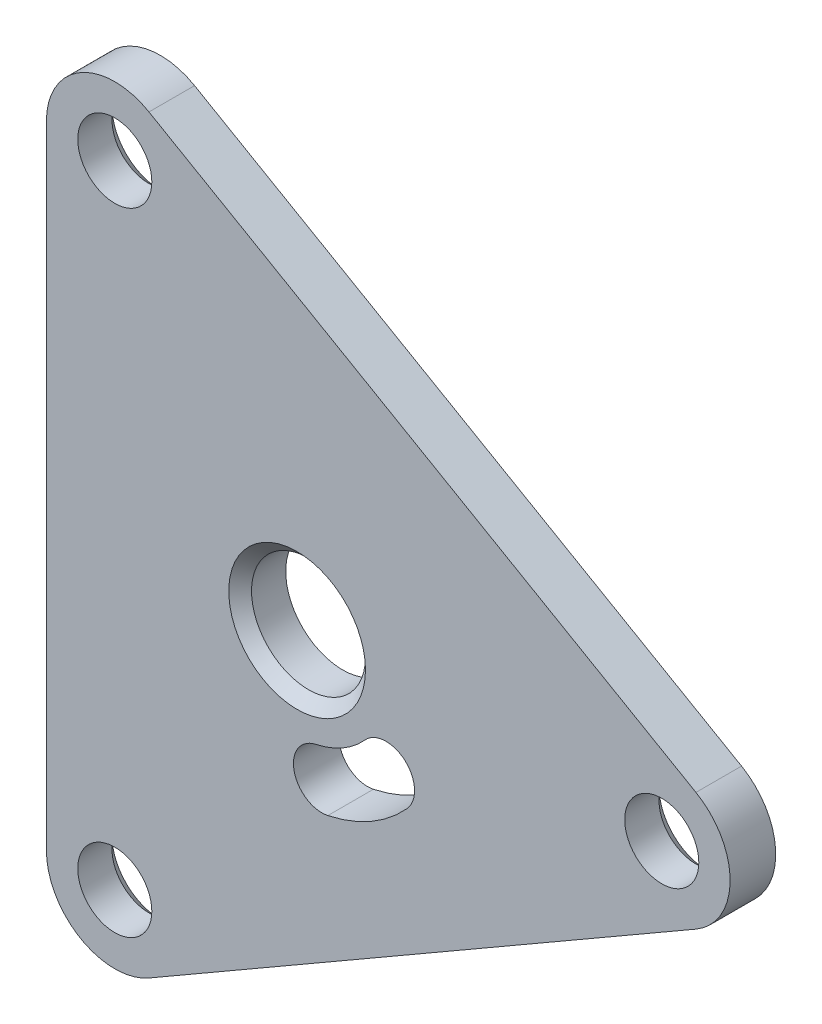
ISO-10303-21;
HEADER;
FILE_DESCRIPTION(('STEP AP214'),'2;1');
FILE_NAME('part.step','',(''),(''),'','','');
FILE_SCHEMA(('AUTOMOTIVE_DESIGN { 1 0 10303 214 1 1 1 1 }'));
ENDSEC;
DATA;
#1=APPLICATION_CONTEXT('core data for automotive mechanical design processes');
#2=APPLICATION_PROTOCOL_DEFINITION('international standard','automotive_design',2000,#1);
#3=PRODUCT_CONTEXT('',#1,'mechanical');
#4=PRODUCT('Part','Part','',(#3));
#5=PRODUCT_RELATED_PRODUCT_CATEGORY('part','',(#4));
#6=PRODUCT_DEFINITION_FORMATION('','',#4);
#7=PRODUCT_DEFINITION_CONTEXT('part definition',#1,'design');
#8=PRODUCT_DEFINITION('design','',#6,#7);
#9=PRODUCT_DEFINITION_SHAPE('','',#8);
#10=(LENGTH_UNIT() NAMED_UNIT(*) SI_UNIT(.MILLI.,.METRE.));
#11=(NAMED_UNIT(*) PLANE_ANGLE_UNIT() SI_UNIT($,.RADIAN.));
#12=(NAMED_UNIT(*) SI_UNIT($,.STERADIAN.) SOLID_ANGLE_UNIT());
#13=UNCERTAINTY_MEASURE_WITH_UNIT(LENGTH_MEASURE(1.E-05),#10,'distance_accuracy_value','');
#14=(GEOMETRIC_REPRESENTATION_CONTEXT(3) GLOBAL_UNCERTAINTY_ASSIGNED_CONTEXT((#13)) GLOBAL_UNIT_ASSIGNED_CONTEXT((#10,
#11,#12)) REPRESENTATION_CONTEXT('',''));
#15=CARTESIAN_POINT('',(0.,0.,0.));
#16=DIRECTION('',(0.,0.,1.));
#17=DIRECTION('',(1.,0.,0.));
#18=AXIS2_PLACEMENT_3D('',#15,#16,#17);
#19=CARTESIAN_POINT('',(-32.0000000000003,-55.425625842204,7.99999999999992));
#20=DIRECTION('',(0.,0.,1.));
#21=DIRECTION('',(0.999999999999999,0.,0.));
#22=AXIS2_PLACEMENT_3D('',#19,#20,#21);
#23=PLANE('',#22);
#24=CARTESIAN_POINT('',(4.35519764925903,-20.5434236055213,7.99999999999999));
#25=DIRECTION('',(0.,0.,1.));
#26=DIRECTION('',(0.999999999999999,0.,0.));
#27=AXIS2_PLACEMENT_3D('',#24,#25,#26);
#28=CIRCLE('',#27,5.);
#29=CARTESIAN_POINT('',(3.31824582800688,-15.6521322708733,8.00000000000001));
#30=VERTEX_POINT('',#29);
#31=CARTESIAN_POINT('',(5.39214947051117,-25.4347149401692,7.99999999999999));
#32=VERTEX_POINT('',#31);
#33=EDGE_CURVE('E46',#30,#32,#28,.T.);
#34=ORIENTED_EDGE('',*,*,#33,.F.);
#35=CARTESIAN_POINT('',(0.,0.,8.00000000000001));
#36=DIRECTION('',(0.,0.,-1.));
#37=DIRECTION('',(0.999999999999999,0.,0.));
#38=AXIS2_PLACEMENT_3D('',#35,#36,#37);
#39=CIRCLE('',#38,16.);
#40=CARTESIAN_POINT('',(11.896021255967,-10.6997513184924,7.99999999999999));
#41=VERTEX_POINT('',#40);
#42=EDGE_CURVE('E125',#41,#30,#39,.T.);
#43=ORIENTED_EDGE('',*,*,#42,.F.);
#44=CARTESIAN_POINT('',(15.6135278984567,-14.0434236055212,8.00000000000006));
#45=DIRECTION('',(0.,0.,1.));
#46=DIRECTION('',(0.999999999999999,0.,0.));
#47=AXIS2_PLACEMENT_3D('',#44,#45,#46);
#48=CIRCLE('',#47,5.);
#49=CARTESIAN_POINT('',(19.3310345409465,-17.3870958925501,8.00000000000001));
#50=VERTEX_POINT('',#49);
#51=EDGE_CURVE('E110',#50,#41,#48,.T.);
#52=ORIENTED_EDGE('',*,*,#51,.F.);
#53=CARTESIAN_POINT('',(0.,0.,8.00000000000001));
#54=DIRECTION('',(0.,0.,1.));
#55=DIRECTION('',(0.999999999999999,0.,0.));
#56=AXIS2_PLACEMENT_3D('',#53,#54,#55);
#57=CIRCLE('',#56,26.);
#58=EDGE_CURVE('E119',#32,#50,#57,.T.);
#59=ORIENTED_EDGE('',*,*,#58,.F.);
#60=EDGE_LOOP('',(#34,#43,#52,#59));
#61=FACE_BOUND('',#60,.T.);
#62=CARTESIAN_POINT('',(0.,0.,8.00000000000001));
#63=DIRECTION('',(0.,0.,1.));
#64=DIRECTION('',(0.999999999999999,0.,0.));
#65=AXIS2_PLACEMENT_3D('',#62,#63,#64);
#66=CIRCLE('',#65,12.);
#67=CARTESIAN_POINT('',(12.,0.,8.00000000000001));
#68=VERTEX_POINT('',#67);
#69=EDGE_CURVE('E202',#68,#68,#66,.F.);
#70=ORIENTED_EDGE('',*,*,#69,.T.);
#71=EDGE_LOOP('',(#70));
#72=FACE_BOUND('',#71,.T.);
#73=CARTESIAN_POINT('',(-32.0000000000001,55.4256258422039,7.99999999999999));
#74=DIRECTION('',(0.,0.,1.));
#75=DIRECTION('',(0.999999999999999,0.,0.));
#76=AXIS2_PLACEMENT_3D('',#73,#74,#75);
#77=CIRCLE('',#76,6.50000000000001);
#78=CARTESIAN_POINT('',(-25.5000000000001,55.4256258422039,8.));
#79=VERTEX_POINT('',#78);
#80=EDGE_CURVE('E146',#79,#79,#77,.T.);
#81=ORIENTED_EDGE('',*,*,#80,.F.);
#82=EDGE_LOOP('',(#81));
#83=FACE_BOUND('',#82,.T.);
#84=CARTESIAN_POINT('',(-32.0000000000003,-55.425625842204,7.99999999999992));
#85=DIRECTION('',(0.,0.,1.));
#86=DIRECTION('',(0.999999999999999,0.,0.));
#87=AXIS2_PLACEMENT_3D('',#84,#85,#86);
#88=CIRCLE('',#87,12.);
#89=CARTESIAN_POINT('',(-44.0000000000003,-55.425625842204,7.99999999999994));
#90=VERTEX_POINT('',#89);
#91=CARTESIAN_POINT('',(-26.0000000000004,-65.8179306876173,8.00000000000001));
#92=VERTEX_POINT('',#91);
#93=EDGE_CURVE('E168',#90,#92,#88,.T.);
#94=ORIENTED_EDGE('',*,*,#93,.T.);
#95=DIRECTION('',(0.86602540378444,0.5,0.));
#96=VECTOR('',#95,1.);
#97=CARTESIAN_POINT('',(69.9999999999998,-10.3923048454131,7.99999999999999));
#98=LINE('',#97,#96);
#99=CARTESIAN_POINT('',(69.9999999999998,-10.3923048454131,7.99999999999999));
#100=VERTEX_POINT('',#99);
#101=EDGE_CURVE('E171',#92,#100,#98,.T.);
#102=ORIENTED_EDGE('',*,*,#101,.T.);
#103=CARTESIAN_POINT('',(63.9999999999999,1.37657094587709E-13,8.00000000000001));
#104=DIRECTION('',(0.,0.,1.));
#105=DIRECTION('',(0.999999999999999,0.,0.));
#106=AXIS2_PLACEMENT_3D('',#103,#104,#105);
#107=CIRCLE('',#106,12.);
#108=CARTESIAN_POINT('',(69.9999999999999,10.3923048454134,8.00000000000002));
#109=VERTEX_POINT('',#108);
#110=EDGE_CURVE('E173',#100,#109,#107,.T.);
#111=ORIENTED_EDGE('',*,*,#110,.T.);
#112=DIRECTION('',(-0.866025403784438,0.499999999999997,0.));
#113=VECTOR('',#112,1.);
#114=CARTESIAN_POINT('',(-26.0000000000001,65.8179306876173,8.00000000000001));
#115=LINE('',#114,#113);
#116=CARTESIAN_POINT('',(-26.0000000000001,65.8179306876173,8.00000000000001));
#117=VERTEX_POINT('',#116);
#118=EDGE_CURVE('E175',#109,#117,#115,.T.);
#119=ORIENTED_EDGE('',*,*,#118,.T.);
#120=CARTESIAN_POINT('',(-32.0000000000001,55.4256258422039,7.99999999999999));
#121=DIRECTION('',(0.,0.,1.));
#122=DIRECTION('',(0.999999999999999,0.,0.));
#123=AXIS2_PLACEMENT_3D('',#120,#121,#122);
#124=CIRCLE('',#123,12.);
#125=CARTESIAN_POINT('',(-44.0000000000001,55.4256258422039,8.00000000000001));
#126=VERTEX_POINT('',#125);
#127=EDGE_CURVE('E177',#117,#126,#124,.T.);
#128=ORIENTED_EDGE('',*,*,#127,.T.);
#129=DIRECTION('',(0.,-1.,0.));
#130=VECTOR('',#129,1.);
#131=CARTESIAN_POINT('',(-44.0000000000001,55.4256258422039,8.00000000000001));
#132=LINE('',#131,#130);
#133=EDGE_CURVE('E179',#126,#90,#132,.T.);
#134=ORIENTED_EDGE('',*,*,#133,.T.);
#135=EDGE_LOOP('',(#94,#102,#111,#119,#128,#134));
#136=FACE_BOUND('',#135,.T.);
#137=CARTESIAN_POINT('',(63.9999999999999,1.37657094587709E-13,8.00000000000001));
#138=DIRECTION('',(0.,0.,1.));
#139=DIRECTION('',(0.999999999999999,0.,0.));
#140=AXIS2_PLACEMENT_3D('',#137,#138,#139);
#141=CIRCLE('',#140,6.5);
#142=CARTESIAN_POINT('',(70.4999999999999,1.51190756625977E-13,8.00000000000001));
#143=VERTEX_POINT('',#142);
#144=EDGE_CURVE('E149',#143,#143,#141,.T.);
#145=ORIENTED_EDGE('',*,*,#144,.F.);
#146=EDGE_LOOP('',(#145));
#147=FACE_BOUND('',#146,.T.);
#148=CARTESIAN_POINT('',(-32.0000000000003,-55.425625842204,7.99999999999992));
#149=DIRECTION('',(0.,0.,1.));
#150=DIRECTION('',(0.999999999999999,0.,0.));
#151=AXIS2_PLACEMENT_3D('',#148,#149,#150);
#152=CIRCLE('',#151,6.5);
#153=CARTESIAN_POINT('',(-25.5000000000003,-55.425625842204,7.99999999999993));
#154=VERTEX_POINT('',#153);
#155=EDGE_CURVE('E141',#154,#154,#152,.T.);
#156=ORIENTED_EDGE('',*,*,#155,.F.);
#157=EDGE_LOOP('',(#156));
#158=FACE_BOUND('',#157,.T.);
#159=ADVANCED_FACE('F31',(#61,#72,#83,#136,#147,#158),#23,.T.);
#160=CARTESIAN_POINT('',(-32.0000000000004,-55.425625842204,0.));
#161=DIRECTION('',(0.,0.,1.));
#162=DIRECTION('',(0.999999999999999,0.,0.));
#163=AXIS2_PLACEMENT_3D('',#160,#161,#162);
#164=PLANE('',#163);
#165=CARTESIAN_POINT('',(0.,0.,0.));
#166=DIRECTION('',(0.,0.,-1.));
#167=DIRECTION('',(0.999999999999999,0.,0.));
#168=AXIS2_PLACEMENT_3D('',#165,#166,#167);
#169=CIRCLE('',#168,16.);
#170=CARTESIAN_POINT('',(11.896021255967,-10.6997513184924,0.));
#171=VERTEX_POINT('',#170);
#172=CARTESIAN_POINT('',(3.31824582800688,-15.6521322708733,0.));
#173=VERTEX_POINT('',#172);
#174=EDGE_CURVE('E136',#171,#173,#169,.T.);
#175=ORIENTED_EDGE('',*,*,#174,.T.);
#176=CARTESIAN_POINT('',(4.35519764925903,-20.5434236055213,0.));
#177=DIRECTION('',(0.,0.,1.));
#178=DIRECTION('',(0.999999999999999,0.,0.));
#179=AXIS2_PLACEMENT_3D('',#176,#177,#178);
#180=CIRCLE('',#179,5.);
#181=CARTESIAN_POINT('',(5.39214947051117,-25.4347149401692,0.));
#182=VERTEX_POINT('',#181);
#183=EDGE_CURVE('E127',#173,#182,#180,.T.);
#184=ORIENTED_EDGE('',*,*,#183,.T.);
#185=CARTESIAN_POINT('',(0.,0.,0.));
#186=DIRECTION('',(0.,0.,1.));
#187=DIRECTION('',(0.999999999999999,0.,0.));
#188=AXIS2_PLACEMENT_3D('',#185,#186,#187);
#189=CIRCLE('',#188,26.);
#190=CARTESIAN_POINT('',(19.3310345409465,-17.3870958925501,0.));
#191=VERTEX_POINT('',#190);
#192=EDGE_CURVE('E133',#182,#191,#189,.T.);
#193=ORIENTED_EDGE('',*,*,#192,.T.);
#194=CARTESIAN_POINT('',(15.6135278984567,-14.0434236055212,0.));
#195=DIRECTION('',(0.,0.,1.));
#196=DIRECTION('',(0.999999999999999,0.,0.));
#197=AXIS2_PLACEMENT_3D('',#194,#195,#196);
#198=CIRCLE('',#197,5.);
#199=EDGE_CURVE('E54',#191,#171,#198,.T.);
#200=ORIENTED_EDGE('',*,*,#199,.T.);
#201=EDGE_LOOP('',(#175,#184,#193,#200));
#202=FACE_BOUND('',#201,.T.);
#203=CARTESIAN_POINT('',(-32.0000000000001,55.4256258422039,0.));
#204=DIRECTION('',(0.,0.,1.));
#205=DIRECTION('',(0.999999999999999,0.,0.));
#206=AXIS2_PLACEMENT_3D('',#203,#204,#205);
#207=CIRCLE('',#206,8.50000000000004);
#208=CARTESIAN_POINT('',(-23.5000000000001,55.4256258422039,0.));
#209=VERTEX_POINT('',#208);
#210=EDGE_CURVE('E211',#209,#209,#207,.T.);
#211=ORIENTED_EDGE('',*,*,#210,.T.);
#212=EDGE_LOOP('',(#211));
#213=FACE_BOUND('',#212,.T.);
#214=CARTESIAN_POINT('',(-32.0000000000004,-55.425625842204,0.));
#215=DIRECTION('',(0.,0.,1.));
#216=DIRECTION('',(0.999999999999999,0.,0.));
#217=AXIS2_PLACEMENT_3D('',#214,#215,#216);
#218=CIRCLE('',#217,8.50000000000004);
#219=CARTESIAN_POINT('',(-23.5000000000003,-55.425625842204,0.));
#220=VERTEX_POINT('',#219);
#221=EDGE_CURVE('E208',#220,#220,#218,.T.);
#222=ORIENTED_EDGE('',*,*,#221,.T.);
#223=EDGE_LOOP('',(#222));
#224=FACE_BOUND('',#223,.T.);
#225=CARTESIAN_POINT('',(64.,1.33293180843455E-13,0.));
#226=DIRECTION('',(0.,0.,1.));
#227=DIRECTION('',(0.999999999999999,0.,0.));
#228=AXIS2_PLACEMENT_3D('',#225,#226,#227);
#229=CIRCLE('',#228,8.50000000000004);
#230=CARTESIAN_POINT('',(72.5,1.50991046585805E-13,0.));
#231=VERTEX_POINT('',#230);
#232=EDGE_CURVE('E205',#231,#231,#229,.T.);
#233=ORIENTED_EDGE('',*,*,#232,.T.);
#234=EDGE_LOOP('',(#233));
#235=FACE_BOUND('',#234,.T.);
#236=CARTESIAN_POINT('',(0.,0.,0.));
#237=DIRECTION('',(0.,0.,1.));
#238=DIRECTION('',(0.999999999999999,0.,0.));
#239=AXIS2_PLACEMENT_3D('',#236,#237,#238);
#240=CIRCLE('',#239,10.);
#241=CARTESIAN_POINT('',(9.99999999999999,0.,0.));
#242=VERTEX_POINT('',#241);
#243=EDGE_CURVE('E152',#242,#242,#240,.T.);
#244=ORIENTED_EDGE('',*,*,#243,.T.);
#245=EDGE_LOOP('',(#244));
#246=FACE_BOUND('',#245,.T.);
#247=CARTESIAN_POINT('',(-32.0000000000004,-55.425625842204,0.));
#248=DIRECTION('',(0.,0.,1.));
#249=DIRECTION('',(0.999999999999999,0.,0.));
#250=AXIS2_PLACEMENT_3D('',#247,#248,#249);
#251=CIRCLE('',#250,12.);
#252=CARTESIAN_POINT('',(-44.0000000000004,-55.425625842204,0.));
#253=VERTEX_POINT('',#252);
#254=CARTESIAN_POINT('',(-26.0000000000004,-65.8179306876173,0.));
#255=VERTEX_POINT('',#254);
#256=EDGE_CURVE('E155',#253,#255,#251,.T.);
#257=ORIENTED_EDGE('',*,*,#256,.F.);
#258=DIRECTION('',(0.,-1.,0.));
#259=VECTOR('',#258,1.);
#260=CARTESIAN_POINT('',(-44.0000000000001,55.4256258422039,0.));
#261=LINE('',#260,#259);
#262=CARTESIAN_POINT('',(-44.0000000000001,55.4256258422039,0.));
#263=VERTEX_POINT('',#262);
#264=EDGE_CURVE('E166',#263,#253,#261,.T.);
#265=ORIENTED_EDGE('',*,*,#264,.F.);
#266=CARTESIAN_POINT('',(-32.0000000000001,55.4256258422039,0.));
#267=DIRECTION('',(0.,0.,1.));
#268=DIRECTION('',(0.999999999999999,0.,0.));
#269=AXIS2_PLACEMENT_3D('',#266,#267,#268);
#270=CIRCLE('',#269,12.);
#271=CARTESIAN_POINT('',(-26.0000000000001,65.8179306876173,0.));
#272=VERTEX_POINT('',#271);
#273=EDGE_CURVE('E164',#272,#263,#270,.T.);
#274=ORIENTED_EDGE('',*,*,#273,.F.);
#275=DIRECTION('',(-0.866025403784438,0.499999999999997,0.));
#276=VECTOR('',#275,1.);
#277=CARTESIAN_POINT('',(-26.0000000000001,65.8179306876173,0.));
#278=LINE('',#277,#276);
#279=CARTESIAN_POINT('',(70.,10.3923048454134,0.));
#280=VERTEX_POINT('',#279);
#281=EDGE_CURVE('E162',#280,#272,#278,.T.);
#282=ORIENTED_EDGE('',*,*,#281,.F.);
#283=CARTESIAN_POINT('',(64.,1.33293180843455E-13,0.));
#284=DIRECTION('',(0.,0.,1.));
#285=DIRECTION('',(0.999999999999999,0.,0.));
#286=AXIS2_PLACEMENT_3D('',#283,#284,#285);
#287=CIRCLE('',#286,12.);
#288=CARTESIAN_POINT('',(69.9999999999998,-10.3923048454131,0.));
#289=VERTEX_POINT('',#288);
#290=EDGE_CURVE('E160',#289,#280,#287,.T.);
#291=ORIENTED_EDGE('',*,*,#290,.F.);
#292=DIRECTION('',(0.86602540378444,0.5,0.));
#293=VECTOR('',#292,1.);
#294=CARTESIAN_POINT('',(69.9999999999998,-10.3923048454131,0.));
#295=LINE('',#294,#293);
#296=EDGE_CURVE('E158',#255,#289,#295,.T.);
#297=ORIENTED_EDGE('',*,*,#296,.F.);
#298=EDGE_LOOP('',(#257,#265,#274,#282,#291,#297));
#299=FACE_BOUND('',#298,.T.);
#300=ADVANCED_FACE('F230',(#202,#213,#224,#235,#246,#299),#164,.F.);
#301=CARTESIAN_POINT('',(-32.0000000000003,-55.425625842204,7.99999999999992));
#302=DIRECTION('',(0.,0.,-1.));
#303=DIRECTION('',(-0.999999999999999,0.,0.));
#304=AXIS2_PLACEMENT_3D('',#301,#302,#303);
#305=CYLINDRICAL_SURFACE('',#304,12.);
#306=ORIENTED_EDGE('',*,*,#256,.T.);
#307=DIRECTION('',(0.,0.,-1.));
#308=VECTOR('',#307,1.);
#309=CARTESIAN_POINT('',(-26.0000000000004,-65.8179306876173,8.00000000000001));
#310=LINE('',#309,#308);
#311=EDGE_CURVE('E196',#92,#255,#310,.T.);
#312=ORIENTED_EDGE('',*,*,#311,.F.);
#313=ORIENTED_EDGE('',*,*,#93,.F.);
#314=DIRECTION('',(0.,0.,-1.));
#315=VECTOR('',#314,1.);
#316=CARTESIAN_POINT('',(-44.0000000000003,-55.425625842204,7.99999999999994));
#317=LINE('',#316,#315);
#318=EDGE_CURVE('E181',#90,#253,#317,.T.);
#319=ORIENTED_EDGE('',*,*,#318,.T.);
#320=EDGE_LOOP('',(#306,#312,#313,#319));
#321=FACE_BOUND('',#320,.T.);
#322=ADVANCED_FACE('F33',(#321),#305,.T.);
#323=CARTESIAN_POINT('',(69.9999999999998,-10.3923048454131,7.99999999999999));
#324=DIRECTION('',(-0.499999999999996,0.866025403784439,0.));
#325=DIRECTION('',(-0.86602540378444,-0.5,0.));
#326=AXIS2_PLACEMENT_3D('',#323,#324,#325);
#327=PLANE('',#326);
#328=ORIENTED_EDGE('',*,*,#296,.T.);
#329=DIRECTION('',(0.,0.,-1.));
#330=VECTOR('',#329,1.);
#331=CARTESIAN_POINT('',(69.9999999999998,-10.3923048454131,7.99999999999999));
#332=LINE('',#331,#330);
#333=EDGE_CURVE('E193',#100,#289,#332,.T.);
#334=ORIENTED_EDGE('',*,*,#333,.F.);
#335=ORIENTED_EDGE('',*,*,#101,.F.);
#336=ORIENTED_EDGE('',*,*,#311,.T.);
#337=EDGE_LOOP('',(#328,#334,#335,#336));
#338=FACE_BOUND('',#337,.T.);
#339=ADVANCED_FACE('F265',(#338),#327,.F.);
#340=CARTESIAN_POINT('',(63.9999999999999,1.37657094587709E-13,8.00000000000001));
#341=DIRECTION('',(0.,0.,-1.));
#342=DIRECTION('',(-0.999999999999999,0.,0.));
#343=AXIS2_PLACEMENT_3D('',#340,#341,#342);
#344=CYLINDRICAL_SURFACE('',#343,12.);
#345=ORIENTED_EDGE('',*,*,#290,.T.);
#346=DIRECTION('',(0.,0.,-1.));
#347=VECTOR('',#346,1.);
#348=CARTESIAN_POINT('',(69.9999999999999,10.3923048454134,8.00000000000002));
#349=LINE('',#348,#347);
#350=EDGE_CURVE('E190',#109,#280,#349,.T.);
#351=ORIENTED_EDGE('',*,*,#350,.F.);
#352=ORIENTED_EDGE('',*,*,#110,.F.);
#353=ORIENTED_EDGE('',*,*,#333,.T.);
#354=EDGE_LOOP('',(#345,#351,#352,#353));
#355=FACE_BOUND('',#354,.T.);
#356=ADVANCED_FACE('F262',(#355),#344,.T.);
#357=CARTESIAN_POINT('',(-26.0000000000001,65.8179306876173,8.00000000000001));
#358=DIRECTION('',(-0.5,-0.866025403784442,0.));
#359=DIRECTION('',(0.866025403784438,-0.499999999999997,0.));
#360=AXIS2_PLACEMENT_3D('',#357,#358,#359);
#361=PLANE('',#360);
#362=ORIENTED_EDGE('',*,*,#281,.T.);
#363=DIRECTION('',(0.,0.,-1.));
#364=VECTOR('',#363,1.);
#365=CARTESIAN_POINT('',(-26.0000000000001,65.8179306876173,8.00000000000001));
#366=LINE('',#365,#364);
#367=EDGE_CURVE('E187',#117,#272,#366,.T.);
#368=ORIENTED_EDGE('',*,*,#367,.F.);
#369=ORIENTED_EDGE('',*,*,#118,.F.);
#370=ORIENTED_EDGE('',*,*,#350,.T.);
#371=EDGE_LOOP('',(#362,#368,#369,#370));
#372=FACE_BOUND('',#371,.T.);
#373=ADVANCED_FACE('F257',(#372),#361,.F.);
#374=CARTESIAN_POINT('',(-32.0000000000001,55.4256258422039,7.99999999999999));
#375=DIRECTION('',(0.,0.,-1.));
#376=DIRECTION('',(-0.999999999999999,0.,0.));
#377=AXIS2_PLACEMENT_3D('',#374,#375,#376);
#378=CYLINDRICAL_SURFACE('',#377,12.);
#379=ORIENTED_EDGE('',*,*,#273,.T.);
#380=DIRECTION('',(0.,0.,-1.));
#381=VECTOR('',#380,1.);
#382=CARTESIAN_POINT('',(-44.0000000000001,55.4256258422039,8.00000000000001));
#383=LINE('',#382,#381);
#384=EDGE_CURVE('E184',#126,#263,#383,.T.);
#385=ORIENTED_EDGE('',*,*,#384,.F.);
#386=ORIENTED_EDGE('',*,*,#127,.F.);
#387=ORIENTED_EDGE('',*,*,#367,.T.);
#388=EDGE_LOOP('',(#379,#385,#386,#387));
#389=FACE_BOUND('',#388,.T.);
#390=ADVANCED_FACE('F253',(#389),#378,.T.);
#391=CARTESIAN_POINT('',(-44.0000000000001,55.4256258422039,8.00000000000001));
#392=DIRECTION('',(0.999999999999999,0.,0.));
#393=DIRECTION('',(0.,1.,0.));
#394=AXIS2_PLACEMENT_3D('',#391,#392,#393);
#395=PLANE('',#394);
#396=ORIENTED_EDGE('',*,*,#264,.T.);
#397=ORIENTED_EDGE('',*,*,#318,.F.);
#398=ORIENTED_EDGE('',*,*,#133,.F.);
#399=ORIENTED_EDGE('',*,*,#384,.T.);
#400=EDGE_LOOP('',(#396,#397,#398,#399));
#401=FACE_BOUND('',#400,.T.);
#402=ADVANCED_FACE('F249',(#401),#395,.F.);
#403=CARTESIAN_POINT('',(0.,0.,8.00000000000001));
#404=DIRECTION('',(0.,0.,-1.));
#405=DIRECTION('',(-0.999999999999999,0.,0.));
#406=AXIS2_PLACEMENT_3D('',#403,#404,#405);
#407=CYLINDRICAL_SURFACE('',#406,10.);
#408=CARTESIAN_POINT('',(0.,0.,6.));
#409=DIRECTION('',(0.,0.,1.));
#410=DIRECTION('',(0.999999999999999,0.,0.));
#411=AXIS2_PLACEMENT_3D('',#408,#409,#410);
#412=CIRCLE('',#411,10.);
#413=CARTESIAN_POINT('',(10.,0.,6.));
#414=VERTEX_POINT('',#413);
#415=EDGE_CURVE('E199',#414,#414,#412,.T.);
#416=ORIENTED_EDGE('',*,*,#415,.T.);
#417=EDGE_LOOP('',(#416));
#418=FACE_BOUND('',#417,.T.);
#419=ORIENTED_EDGE('',*,*,#243,.F.);
#420=EDGE_LOOP('',(#419));
#421=FACE_BOUND('',#420,.T.);
#422=ADVANCED_FACE('F290',(#418,#421),#407,.F.);
#423=CARTESIAN_POINT('',(63.9999999999999,1.37657094587709E-13,8.00000000000001));
#424=DIRECTION('',(0.,0.,-1.));
#425=DIRECTION('',(-0.999999999999999,0.,0.));
#426=AXIS2_PLACEMENT_3D('',#423,#424,#425);
#427=CYLINDRICAL_SURFACE('',#426,6.5);
#428=CARTESIAN_POINT('',(64.,1.3437738301594E-13,2.00000000000004));
#429=DIRECTION('',(0.,0.,1.));
#430=DIRECTION('',(0.999999999999999,0.,0.));
#431=AXIS2_PLACEMENT_3D('',#428,#429,#430);
#432=CIRCLE('',#431,6.5);
#433=CARTESIAN_POINT('',(70.5,1.47911045054208E-13,2.00000000000005));
#434=VERTEX_POINT('',#433);
#435=EDGE_CURVE('E11',#434,#434,#432,.F.);
#436=ORIENTED_EDGE('',*,*,#435,.T.);
#437=EDGE_LOOP('',(#436));
#438=FACE_BOUND('',#437,.T.);
#439=ORIENTED_EDGE('',*,*,#144,.T.);
#440=EDGE_LOOP('',(#439));
#441=FACE_BOUND('',#440,.T.);
#442=ADVANCED_FACE('F283',(#438,#441),#427,.F.);
#443=CARTESIAN_POINT('',(-32.0000000000001,55.4256258422039,7.99999999999999));
#444=DIRECTION('',(0.,0.,-1.));
#445=DIRECTION('',(-0.999999999999999,0.,0.));
#446=AXIS2_PLACEMENT_3D('',#443,#444,#445);
#447=CYLINDRICAL_SURFACE('',#446,6.50000000000001);
#448=CARTESIAN_POINT('',(-32.0000000000001,55.4256258422039,2.00000000000005));
#449=DIRECTION('',(0.,0.,1.));
#450=DIRECTION('',(0.999999999999999,0.,0.));
#451=AXIS2_PLACEMENT_3D('',#448,#449,#450);
#452=CIRCLE('',#451,6.50000000000001);
#453=CARTESIAN_POINT('',(-25.5000000000001,55.4256258422039,2.00000000000005));
#454=VERTEX_POINT('',#453);
#455=EDGE_CURVE('E214',#454,#454,#452,.F.);
#456=ORIENTED_EDGE('',*,*,#455,.T.);
#457=EDGE_LOOP('',(#456));
#458=FACE_BOUND('',#457,.T.);
#459=ORIENTED_EDGE('',*,*,#80,.T.);
#460=EDGE_LOOP('',(#459));
#461=FACE_BOUND('',#460,.T.);
#462=ADVANCED_FACE('F275',(#458,#461),#447,.F.);
#463=CARTESIAN_POINT('',(-32.0000000000003,-55.425625842204,7.99999999999992));
#464=DIRECTION('',(0.,0.,-1.));
#465=DIRECTION('',(-0.999999999999999,0.,0.));
#466=AXIS2_PLACEMENT_3D('',#463,#464,#465);
#467=CYLINDRICAL_SURFACE('',#466,6.5);
#468=CARTESIAN_POINT('',(-32.0000000000004,-55.425625842204,1.99999999999997));
#469=DIRECTION('',(0.,0.,1.));
#470=DIRECTION('',(0.999999999999999,0.,0.));
#471=AXIS2_PLACEMENT_3D('',#468,#469,#470);
#472=CIRCLE('',#471,6.5);
#473=CARTESIAN_POINT('',(-25.5000000000004,-55.425625842204,1.99999999999998));
#474=VERTEX_POINT('',#473);
#475=EDGE_CURVE('E39',#474,#474,#472,.F.);
#476=ORIENTED_EDGE('',*,*,#475,.T.);
#477=EDGE_LOOP('',(#476));
#478=FACE_BOUND('',#477,.T.);
#479=ORIENTED_EDGE('',*,*,#155,.T.);
#480=EDGE_LOOP('',(#479));
#481=FACE_BOUND('',#480,.T.);
#482=ADVANCED_FACE('F219',(#478,#481),#467,.F.);
#483=CARTESIAN_POINT('',(0.,0.,6.));
#484=DIRECTION('',(0.,0.,1.));
#485=DIRECTION('',(0.999999999999999,0.,0.));
#486=AXIS2_PLACEMENT_3D('',#483,#484,#485);
#487=CONICAL_SURFACE('',#486,10.,0.78539816339745);
#488=ORIENTED_EDGE('',*,*,#69,.F.);
#489=EDGE_LOOP('',(#488));
#490=FACE_BOUND('',#489,.T.);
#491=ORIENTED_EDGE('',*,*,#415,.F.);
#492=EDGE_LOOP('',(#491));
#493=FACE_BOUND('',#492,.T.);
#494=ADVANCED_FACE('F274',(#490,#493),#487,.F.);
#495=CARTESIAN_POINT('',(-32.0000000000001,55.4256258422039,0.));
#496=DIRECTION('',(0.,0.,-1.));
#497=DIRECTION('',(-0.999999999999999,0.,0.));
#498=AXIS2_PLACEMENT_3D('',#495,#496,#497);
#499=CONICAL_SURFACE('',#498,8.50000000000004,0.785398163397454);
#500=ORIENTED_EDGE('',*,*,#455,.F.);
#501=EDGE_LOOP('',(#500));
#502=FACE_BOUND('',#501,.T.);
#503=ORIENTED_EDGE('',*,*,#210,.F.);
#504=EDGE_LOOP('',(#503));
#505=FACE_BOUND('',#504,.T.);
#506=ADVANCED_FACE('F226',(#502,#505),#499,.F.);
#507=CARTESIAN_POINT('',(-32.0000000000004,-55.425625842204,0.));
#508=DIRECTION('',(0.,0.,-1.));
#509=DIRECTION('',(-0.999999999999999,0.,0.));
#510=AXIS2_PLACEMENT_3D('',#507,#508,#509);
#511=CONICAL_SURFACE('',#510,8.50000000000004,0.785398163397453);
#512=ORIENTED_EDGE('',*,*,#475,.F.);
#513=EDGE_LOOP('',(#512));
#514=FACE_BOUND('',#513,.T.);
#515=ORIENTED_EDGE('',*,*,#221,.F.);
#516=EDGE_LOOP('',(#515));
#517=FACE_BOUND('',#516,.T.);
#518=ADVANCED_FACE('F222',(#514,#517),#511,.F.);
#519=CARTESIAN_POINT('',(64.,1.33293180843455E-13,0.));
#520=DIRECTION('',(0.,0.,-1.));
#521=DIRECTION('',(-0.999999999999999,0.,0.));
#522=AXIS2_PLACEMENT_3D('',#519,#520,#521);
#523=CONICAL_SURFACE('',#522,8.50000000000004,0.785398163397453);
#524=ORIENTED_EDGE('',*,*,#435,.F.);
#525=EDGE_LOOP('',(#524));
#526=FACE_BOUND('',#525,.T.);
#527=ORIENTED_EDGE('',*,*,#232,.F.);
#528=EDGE_LOOP('',(#527));
#529=FACE_BOUND('',#528,.T.);
#530=ADVANCED_FACE('F225',(#526,#529),#523,.F.);
#531=CARTESIAN_POINT('',(4.35519764925903,-20.5434236055213,0.));
#532=DIRECTION('',(0.,0.,1.));
#533=DIRECTION('',(0.999999999999999,0.,0.));
#534=AXIS2_PLACEMENT_3D('',#531,#532,#533);
#535=CYLINDRICAL_SURFACE('',#534,5.);
#536=ORIENTED_EDGE('',*,*,#33,.T.);
#537=DIRECTION('',(0.,0.,1.));
#538=VECTOR('',#537,1.);
#539=CARTESIAN_POINT('',(5.39214947051117,-25.4347149401692,0.));
#540=LINE('',#539,#538);
#541=EDGE_CURVE('E116',#182,#32,#540,.T.);
#542=ORIENTED_EDGE('',*,*,#541,.F.);
#543=ORIENTED_EDGE('',*,*,#183,.F.);
#544=DIRECTION('',(0.,0.,1.));
#545=VECTOR('',#544,1.);
#546=CARTESIAN_POINT('',(3.31824582800688,-15.6521322708733,0.));
#547=LINE('',#546,#545);
#548=EDGE_CURVE('E139',#173,#30,#547,.T.);
#549=ORIENTED_EDGE('',*,*,#548,.T.);
#550=EDGE_LOOP('',(#536,#542,#543,#549));
#551=FACE_BOUND('',#550,.T.);
#552=ADVANCED_FACE('F390',(#551),#535,.F.);
#553=CARTESIAN_POINT('',(0.,0.,0.));
#554=DIRECTION('',(0.,0.,1.));
#555=DIRECTION('',(0.999999999999999,0.,0.));
#556=AXIS2_PLACEMENT_3D('',#553,#554,#555);
#557=CYLINDRICAL_SURFACE('',#556,16.);
#558=ORIENTED_EDGE('',*,*,#42,.T.);
#559=ORIENTED_EDGE('',*,*,#548,.F.);
#560=ORIENTED_EDGE('',*,*,#174,.F.);
#561=DIRECTION('',(0.,0.,1.));
#562=VECTOR('',#561,1.);
#563=CARTESIAN_POINT('',(11.896021255967,-10.6997513184924,0.));
#564=LINE('',#563,#562);
#565=EDGE_CURVE('E115',#171,#41,#564,.T.);
#566=ORIENTED_EDGE('',*,*,#565,.T.);
#567=EDGE_LOOP('',(#558,#559,#560,#566));
#568=FACE_BOUND('',#567,.T.);
#569=ADVANCED_FACE('F399',(#568),#557,.T.);
#570=CARTESIAN_POINT('',(15.6135278984567,-14.0434236055212,0.));
#571=DIRECTION('',(0.,0.,1.));
#572=DIRECTION('',(0.999999999999999,0.,0.));
#573=AXIS2_PLACEMENT_3D('',#570,#571,#572);
#574=CYLINDRICAL_SURFACE('',#573,5.);
#575=ORIENTED_EDGE('',*,*,#51,.T.);
#576=ORIENTED_EDGE('',*,*,#565,.F.);
#577=ORIENTED_EDGE('',*,*,#199,.F.);
#578=DIRECTION('',(0.,0.,1.));
#579=VECTOR('',#578,1.);
#580=CARTESIAN_POINT('',(19.3310345409465,-17.3870958925501,0.));
#581=LINE('',#580,#579);
#582=EDGE_CURVE('E106',#191,#50,#581,.T.);
#583=ORIENTED_EDGE('',*,*,#582,.T.);
#584=EDGE_LOOP('',(#575,#576,#577,#583));
#585=FACE_BOUND('',#584,.T.);
#586=ADVANCED_FACE('F108',(#585),#574,.F.);
#587=CARTESIAN_POINT('',(0.,0.,0.));
#588=DIRECTION('',(0.,0.,1.));
#589=DIRECTION('',(0.999999999999999,0.,0.));
#590=AXIS2_PLACEMENT_3D('',#587,#588,#589);
#591=CYLINDRICAL_SURFACE('',#590,26.);
#592=ORIENTED_EDGE('',*,*,#58,.T.);
#593=ORIENTED_EDGE('',*,*,#582,.F.);
#594=ORIENTED_EDGE('',*,*,#192,.F.);
#595=ORIENTED_EDGE('',*,*,#541,.T.);
#596=EDGE_LOOP('',(#592,#593,#594,#595));
#597=FACE_BOUND('',#596,.T.);
#598=ADVANCED_FACE('F120',(#597),#591,.F.);
#599=CLOSED_SHELL('',(#159,#300,#322,#339,#356,#373,#390,#402,#422,#442,#462,#482,#494,#506,
#518,#530,#552,#569,#586,#598));
#600=MANIFOLD_SOLID_BREP('B2',#599);
#601=ADVANCED_BREP_SHAPE_REPRESENTATION('',(#18,#600),#14);
#602=SHAPE_DEFINITION_REPRESENTATION(#9,#601);
ENDSEC;
END-ISO-10303-21;
